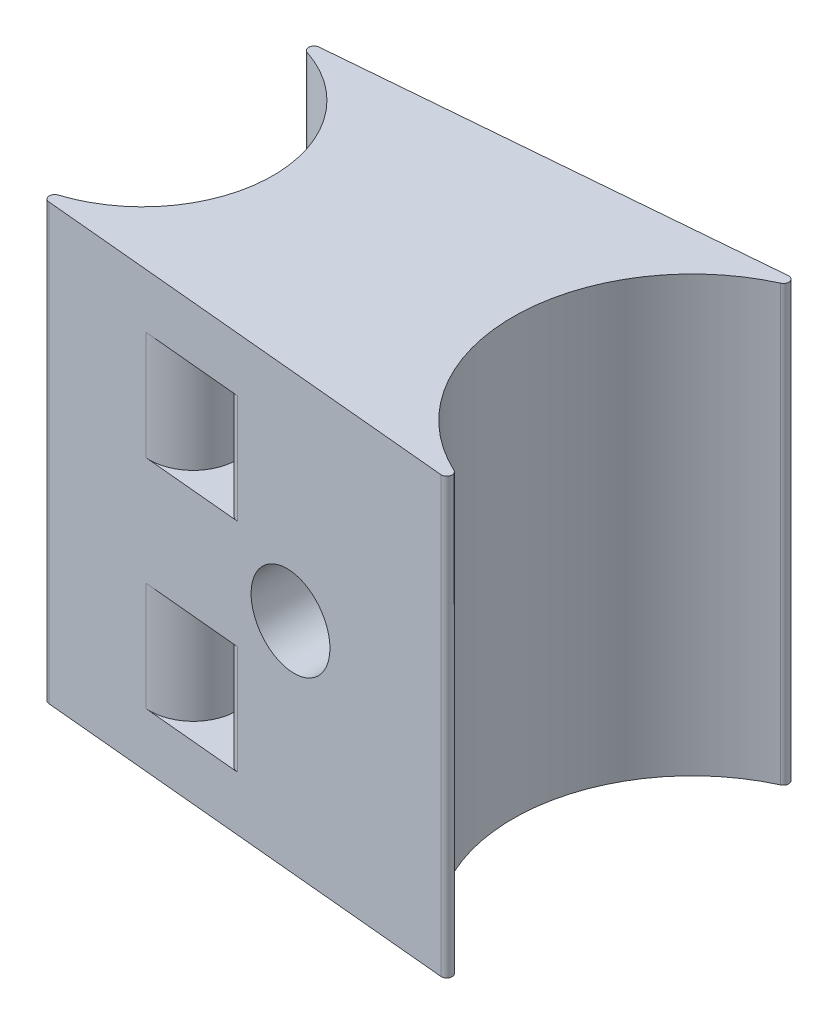
ISO-10303-21;
HEADER;
FILE_DESCRIPTION(('STEP AP214'),'2;1');
FILE_NAME('part.step','',(''),(''),'','','');
FILE_SCHEMA(('AUTOMOTIVE_DESIGN { 1 0 10303 214 1 1 1 1 }'));
ENDSEC;
DATA;
#1=APPLICATION_CONTEXT('core data for automotive mechanical design processes');
#2=APPLICATION_PROTOCOL_DEFINITION('international standard','automotive_design',2000,#1);
#3=PRODUCT_CONTEXT('',#1,'mechanical');
#4=PRODUCT('Part','Part','',(#3));
#5=PRODUCT_RELATED_PRODUCT_CATEGORY('part','',(#4));
#6=PRODUCT_DEFINITION_FORMATION('','',#4);
#7=PRODUCT_DEFINITION_CONTEXT('part definition',#1,'design');
#8=PRODUCT_DEFINITION('design','',#6,#7);
#9=PRODUCT_DEFINITION_SHAPE('','',#8);
#10=(LENGTH_UNIT() NAMED_UNIT(*) SI_UNIT(.MILLI.,.METRE.));
#11=(NAMED_UNIT(*) PLANE_ANGLE_UNIT() SI_UNIT($,.RADIAN.));
#12=(NAMED_UNIT(*) SI_UNIT($,.STERADIAN.) SOLID_ANGLE_UNIT());
#13=UNCERTAINTY_MEASURE_WITH_UNIT(LENGTH_MEASURE(1.E-05),#10,'distance_accuracy_value','');
#14=(GEOMETRIC_REPRESENTATION_CONTEXT(3) GLOBAL_UNCERTAINTY_ASSIGNED_CONTEXT((#13)) GLOBAL_UNIT_ASSIGNED_CONTEXT((#10,
#11,#12)) REPRESENTATION_CONTEXT('',''));
#15=CARTESIAN_POINT('',(0.,0.,0.));
#16=DIRECTION('',(0.,0.,1.));
#17=DIRECTION('',(1.,0.,0.));
#18=AXIS2_PLACEMENT_3D('',#15,#16,#17);
#19=CARTESIAN_POINT('',(21.8612762014715,20.,-7.62602887624097));
#20=DIRECTION('',(0.,-1.,0.));
#21=DIRECTION('',(0.,0.,-1.));
#22=AXIS2_PLACEMENT_3D('',#19,#20,#21);
#23=CYLINDRICAL_SURFACE('',#22,0.25);
#24=CARTESIAN_POINT('',(21.8612762014715,0.,-7.62602887624097));
#25=DIRECTION('',(0.,1.,0.));
#26=DIRECTION('',(0.,0.,-1.));
#27=AXIS2_PLACEMENT_3D('',#24,#25,#26);
#28=CIRCLE('',#27,0.25);
#29=CARTESIAN_POINT('',(21.9653502400434,0.,-7.39872160733973));
#30=VERTEX_POINT('',#29);
#31=CARTESIAN_POINT('',(21.8401348031813,0.,-7.87513335488063));
#32=VERTEX_POINT('',#31);
#33=EDGE_CURVE('E218',#30,#32,#28,.T.);
#34=ORIENTED_EDGE('',*,*,#33,.T.);
#35=DIRECTION('',(0.,-1.,0.));
#36=VECTOR('',#35,1.);
#37=CARTESIAN_POINT('',(21.8401348031813,20.,-7.87513335488063));
#38=LINE('',#37,#36);
#39=CARTESIAN_POINT('',(21.8401348031813,20.,-7.87513335488063));
#40=VERTEX_POINT('',#39);
#41=EDGE_CURVE('E199',#40,#32,#38,.T.);
#42=ORIENTED_EDGE('',*,*,#41,.F.);
#43=CARTESIAN_POINT('',(21.8612762014715,20.,-7.62602887624097));
#44=DIRECTION('',(0.,1.,0.));
#45=DIRECTION('',(0.,0.,-1.));
#46=AXIS2_PLACEMENT_3D('',#43,#44,#45);
#47=CIRCLE('',#46,0.25);
#48=CARTESIAN_POINT('',(21.9653502400434,20.,-7.39872160733973));
#49=VERTEX_POINT('',#48);
#50=EDGE_CURVE('E206',#49,#40,#47,.T.);
#51=ORIENTED_EDGE('',*,*,#50,.F.);
#52=DIRECTION('',(0.,-1.,0.));
#53=VECTOR('',#52,1.);
#54=CARTESIAN_POINT('',(21.9653502400434,20.,-7.39872160733973));
#55=LINE('',#54,#53);
#56=EDGE_CURVE('E365',#49,#30,#55,.T.);
#57=ORIENTED_EDGE('',*,*,#56,.T.);
#58=EDGE_LOOP('',(#34,#42,#51,#57));
#59=FACE_BOUND('',#58,.T.);
#60=ADVANCED_FACE('F33',(#59),#23,.T.);
#61=CARTESIAN_POINT('',(1.93332190227241,20.,-6.18565004039137));
#62=DIRECTION('',(0.0845655931607277,0.,0.996417914558633));
#63=DIRECTION('',(0.996417914558633,0.,-0.0845655931607277));
#64=AXIS2_PLACEMENT_3D('',#61,#62,#63);
#65=PLANE('',#64);
#66=DIRECTION('',(0.,1.,0.));
#67=VECTOR('',#66,1.);
#68=CARTESIAN_POINT('',(11.4577172034196,20.,-6.99398169156962));
#69=LINE('',#68,#67);
#70=CARTESIAN_POINT('',(11.4577172034196,12.5,-6.99398169156962));
#71=VERTEX_POINT('',#70);
#72=CARTESIAN_POINT('',(11.4577172034196,17.5,-6.99398169156962));
#73=VERTEX_POINT('',#72);
#74=EDGE_CURVE('E276',#71,#73,#69,.T.);
#75=ORIENTED_EDGE('',*,*,#74,.T.);
#76=DIRECTION('',(-0.996417914558633,0.,0.0845655931607277));
#77=VECTOR('',#76,1.);
#78=CARTESIAN_POINT('',(1.93332190227241,17.5,-6.18565004039137));
#79=LINE('',#78,#77);
#80=CARTESIAN_POINT('',(6.83086881367855,17.5,-6.60130290405853));
#81=VERTEX_POINT('',#80);
#82=EDGE_CURVE('E351',#73,#81,#79,.T.);
#83=ORIENTED_EDGE('',*,*,#82,.T.);
#84=DIRECTION('',(0.,-1.,0.));
#85=VECTOR('',#84,1.);
#86=CARTESIAN_POINT('',(6.83086881367855,20.,-6.60130290405853));
#87=LINE('',#86,#85);
#88=CARTESIAN_POINT('',(6.83086881367854,12.5,-6.60130290405853));
#89=VERTEX_POINT('',#88);
#90=EDGE_CURVE('E235',#81,#89,#87,.T.);
#91=ORIENTED_EDGE('',*,*,#90,.T.);
#92=DIRECTION('',(0.996417914558633,0.,-0.0845655931607277));
#93=VECTOR('',#92,1.);
#94=CARTESIAN_POINT('',(1.93332190227241,12.5,-6.18565004039137));
#95=LINE('',#94,#93);
#96=EDGE_CURVE('E353',#89,#71,#95,.T.);
#97=ORIENTED_EDGE('',*,*,#96,.T.);
#98=EDGE_LOOP('',(#75,#83,#91,#97));
#99=FACE_BOUND('',#98,.T.);
#100=DIRECTION('',(0.,1.,0.));
#101=VECTOR('',#100,1.);
#102=CARTESIAN_POINT('',(11.4577172034196,20.,-6.99398169156962));
#103=LINE('',#102,#101);
#104=CARTESIAN_POINT('',(11.4577172034196,2.5,-6.99398169156962));
#105=VERTEX_POINT('',#104);
#106=CARTESIAN_POINT('',(11.4577172034196,7.5,-6.99398169156962));
#107=VERTEX_POINT('',#106);
#108=EDGE_CURVE('E273',#105,#107,#103,.T.);
#109=ORIENTED_EDGE('',*,*,#108,.T.);
#110=DIRECTION('',(-0.996417914558633,0.,0.0845655931607277));
#111=VECTOR('',#110,1.);
#112=CARTESIAN_POINT('',(1.93332190227241,7.5,-6.18565004039137));
#113=LINE('',#112,#111);
#114=CARTESIAN_POINT('',(6.83086881367855,7.5,-6.60130290405853));
#115=VERTEX_POINT('',#114);
#116=EDGE_CURVE('E347',#107,#115,#113,.T.);
#117=ORIENTED_EDGE('',*,*,#116,.T.);
#118=DIRECTION('',(0.,-1.,0.));
#119=VECTOR('',#118,1.);
#120=CARTESIAN_POINT('',(6.83086881367854,20.,-6.60130290405853));
#121=LINE('',#120,#119);
#122=CARTESIAN_POINT('',(6.83086881367854,2.5,-6.60130290405853));
#123=VERTEX_POINT('',#122);
#124=EDGE_CURVE('E238',#115,#123,#121,.T.);
#125=ORIENTED_EDGE('',*,*,#124,.T.);
#126=DIRECTION('',(0.996417914558633,0.,-0.0845655931607277));
#127=VECTOR('',#126,1.);
#128=CARTESIAN_POINT('',(1.93332190227241,2.5,-6.18565004039137));
#129=LINE('',#128,#127);
#130=EDGE_CURVE('E349',#123,#105,#129,.T.);
#131=ORIENTED_EDGE('',*,*,#130,.T.);
#132=EDGE_LOOP('',(#109,#117,#125,#131));
#133=FACE_BOUND('',#132,.T.);
#134=CARTESIAN_POINT('',(14.1497935129148,10.,-7.22245714009389));
#135=DIRECTION('',(0.0845655931607277,0.,0.996417914558633));
#136=DIRECTION('',(-0.996417914558632,0.,0.0845655931607277));
#137=AXIS2_PLACEMENT_3D('',#134,#135,#136);
#138=ELLIPSE('',#137,2.00718992581131,2.);
#139=CARTESIAN_POINT('',(12.1497935129148,10.,-7.05271793343142));
#140=VERTEX_POINT('',#139);
#141=EDGE_CURVE('E227',#140,#140,#138,.T.);
#142=ORIENTED_EDGE('',*,*,#141,.T.);
#143=EDGE_LOOP('',(#142));
#144=FACE_BOUND('',#143,.T.);
#145=DIRECTION('',(-0.996417914558632,0.,0.0845655931607277));
#146=VECTOR('',#145,1.);
#147=CARTESIAN_POINT('',(1.93332190227241,0.,-6.18565004039137));
#148=LINE('',#147,#146);
#149=CARTESIAN_POINT('',(1.93332190227241,0.,-6.18565004039137));
#150=VERTEX_POINT('',#149);
#151=EDGE_CURVE('E367',#32,#150,#148,.T.);
#152=ORIENTED_EDGE('',*,*,#151,.T.);
#153=DIRECTION('',(0.,-1.,0.));
#154=VECTOR('',#153,1.);
#155=CARTESIAN_POINT('',(1.93332190227241,20.,-6.18565004039137));
#156=LINE('',#155,#154);
#157=CARTESIAN_POINT('',(1.93332190227241,20.,-6.18565004039137));
#158=VERTEX_POINT('',#157);
#159=EDGE_CURVE('E202',#158,#150,#156,.T.);
#160=ORIENTED_EDGE('',*,*,#159,.F.);
#161=DIRECTION('',(-0.996417914558632,0.,0.0845655931607277));
#162=VECTOR('',#161,1.);
#163=CARTESIAN_POINT('',(1.93332190227241,20.,-6.18565004039137));
#164=LINE('',#163,#162);
#165=EDGE_CURVE('E195',#40,#158,#164,.T.);
#166=ORIENTED_EDGE('',*,*,#165,.F.);
#167=ORIENTED_EDGE('',*,*,#41,.T.);
#168=EDGE_LOOP('',(#152,#160,#166,#167));
#169=FACE_BOUND('',#168,.T.);
#170=ADVANCED_FACE('F197',(#99,#133,#144,#169),#65,.F.);
#171=CARTESIAN_POINT('',(1.95446330056259,20.,-5.93654556175172));
#172=DIRECTION('',(0.,-1.,0.));
#173=DIRECTION('',(0.,0.,-1.));
#174=AXIS2_PLACEMENT_3D('',#171,#172,#173);
#175=CYLINDRICAL_SURFACE('',#174,0.25);
#176=CARTESIAN_POINT('',(1.95446330056259,0.,-5.93654556175172));
#177=DIRECTION('',(0.,1.,0.));
#178=DIRECTION('',(0.,0.,1.));
#179=AXIS2_PLACEMENT_3D('',#176,#177,#178);
#180=CIRCLE('',#179,0.25);
#181=CARTESIAN_POINT('',(1.87628476854009,0.,-5.69908373928165));
#182=VERTEX_POINT('',#181);
#183=EDGE_CURVE('E369',#150,#182,#180,.T.);
#184=ORIENTED_EDGE('',*,*,#183,.T.);
#185=DIRECTION('',(0.,-1.,0.));
#186=VECTOR('',#185,1.);
#187=CARTESIAN_POINT('',(1.87628476854009,20.,-5.69908373928165));
#188=LINE('',#187,#186);
#189=CARTESIAN_POINT('',(1.87628476854009,20.,-5.69908373928165));
#190=VERTEX_POINT('',#189);
#191=EDGE_CURVE('E221',#190,#182,#188,.T.);
#192=ORIENTED_EDGE('',*,*,#191,.F.);
#193=CARTESIAN_POINT('',(1.95446330056259,20.,-5.93654556175172));
#194=DIRECTION('',(0.,1.,0.));
#195=DIRECTION('',(0.,0.,1.));
#196=AXIS2_PLACEMENT_3D('',#193,#194,#195);
#197=CIRCLE('',#196,0.25);
#198=EDGE_CURVE('E205',#158,#190,#197,.T.);
#199=ORIENTED_EDGE('',*,*,#198,.F.);
#200=ORIENTED_EDGE('',*,*,#159,.T.);
#201=EDGE_LOOP('',(#184,#192,#199,#200));
#202=FACE_BOUND('',#201,.T.);
#203=ADVANCED_FACE('F416',(#202),#175,.T.);
#204=CARTESIAN_POINT('',(0.,20.,0.));
#205=DIRECTION('',(0.,-1.,0.));
#206=DIRECTION('',(0.,0.,-1.));
#207=AXIS2_PLACEMENT_3D('',#204,#205,#206);
#208=CYLINDRICAL_SURFACE('',#207,6.);
#209=CARTESIAN_POINT('',(0.,0.,0.));
#210=DIRECTION('',(0.,-1.,0.));
#211=DIRECTION('',(0.,0.,1.));
#212=AXIS2_PLACEMENT_3D('',#209,#210,#211);
#213=CIRCLE('',#212,6.);
#214=CARTESIAN_POINT('',(1.83026426573769,0.,5.71402946418407));
#215=VERTEX_POINT('',#214);
#216=EDGE_CURVE('E371',#182,#215,#213,.T.);
#217=ORIENTED_EDGE('',*,*,#216,.T.);
#218=DIRECTION('',(0.,-1.,0.));
#219=VECTOR('',#218,1.);
#220=CARTESIAN_POINT('',(1.83026426573769,20.,5.71402946418407));
#221=LINE('',#220,#219);
#222=CARTESIAN_POINT('',(1.83026426573769,20.,5.71402946418407));
#223=VERTEX_POINT('',#222);
#224=EDGE_CURVE('E390',#223,#215,#221,.T.);
#225=ORIENTED_EDGE('',*,*,#224,.F.);
#226=CARTESIAN_POINT('',(0.,20.,0.));
#227=DIRECTION('',(0.,-1.,0.));
#228=DIRECTION('',(0.,0.,1.));
#229=AXIS2_PLACEMENT_3D('',#226,#227,#228);
#230=CIRCLE('',#229,6.);
#231=EDGE_CURVE('E356',#190,#223,#230,.T.);
#232=ORIENTED_EDGE('',*,*,#231,.F.);
#233=ORIENTED_EDGE('',*,*,#191,.T.);
#234=EDGE_LOOP('',(#217,#225,#232,#233));
#235=FACE_BOUND('',#234,.T.);
#236=ADVANCED_FACE('F397',(#235),#208,.F.);
#237=CARTESIAN_POINT('',(1.90652527681009,20.,5.95211402519174));
#238=DIRECTION('',(0.,-1.,0.));
#239=DIRECTION('',(0.,0.,-1.));
#240=AXIS2_PLACEMENT_3D('',#237,#238,#239);
#241=CYLINDRICAL_SURFACE('',#240,0.250000000000001);
#242=CARTESIAN_POINT('',(1.90652527681009,0.,5.95211402519174));
#243=DIRECTION('',(0.,1.,0.));
#244=DIRECTION('',(0.,0.,-1.));
#245=AXIS2_PLACEMENT_3D('',#242,#243,#244);
#246=CIRCLE('',#245,0.250000000000001);
#247=CARTESIAN_POINT('',(1.88337569658017,0.,6.20103991162218));
#248=VERTEX_POINT('',#247);
#249=EDGE_CURVE('E373',#215,#248,#246,.T.);
#250=ORIENTED_EDGE('',*,*,#249,.T.);
#251=DIRECTION('',(0.,-1.,0.));
#252=VECTOR('',#251,1.);
#253=CARTESIAN_POINT('',(1.88337569658017,20.,6.20103991162218));
#254=LINE('',#253,#252);
#255=CARTESIAN_POINT('',(1.88337569658017,20.,6.20103991162218));
#256=VERTEX_POINT('',#255);
#257=EDGE_CURVE('E387',#256,#248,#254,.T.);
#258=ORIENTED_EDGE('',*,*,#257,.F.);
#259=CARTESIAN_POINT('',(1.90652527681009,20.,5.95211402519174));
#260=DIRECTION('',(0.,1.,0.));
#261=DIRECTION('',(0.,0.,-1.));
#262=AXIS2_PLACEMENT_3D('',#259,#260,#261);
#263=CIRCLE('',#262,0.250000000000001);
#264=EDGE_CURVE('E358',#223,#256,#263,.T.);
#265=ORIENTED_EDGE('',*,*,#264,.F.);
#266=ORIENTED_EDGE('',*,*,#224,.T.);
#267=EDGE_LOOP('',(#250,#258,#265,#266));
#268=FACE_BOUND('',#267,.T.);
#269=ADVANCED_FACE('F408',(#268),#241,.T.);
#270=CARTESIAN_POINT('',(1.88337569658017,20.,6.20103991162218));
#271=DIRECTION('',(0.0925983209196808,0.,-0.995703545721745));
#272=DIRECTION('',(-0.995703545721745,0.,-0.0925983209196808));
#273=AXIS2_PLACEMENT_3D('',#270,#271,#272);
#274=PLANE('',#273);
#275=DIRECTION('',(0.,-1.,0.));
#276=VECTOR('',#275,1.);
#277=CARTESIAN_POINT('',(11.4537008395402,20.,7.0910598806192));
#278=LINE('',#277,#276);
#279=CARTESIAN_POINT('',(11.4537008395402,17.5,7.0910598806192));
#280=VERTEX_POINT('',#279);
#281=CARTESIAN_POINT('',(11.4537008395402,12.5,7.0910598806192));
#282=VERTEX_POINT('',#281);
#283=EDGE_CURVE('E287',#280,#282,#278,.T.);
#284=ORIENTED_EDGE('',*,*,#283,.T.);
#285=DIRECTION('',(-0.995703545721745,0.,-0.0925983209196808));
#286=VECTOR('',#285,1.);
#287=CARTESIAN_POINT('',(1.88337569658017,12.5,6.20103991162218));
#288=LINE('',#287,#286);
#289=CARTESIAN_POINT('',(6.81480335816064,12.5,6.65965223972051));
#290=VERTEX_POINT('',#289);
#291=EDGE_CURVE('E233',#282,#290,#288,.T.);
#292=ORIENTED_EDGE('',*,*,#291,.T.);
#293=DIRECTION('',(0.,1.,0.));
#294=VECTOR('',#293,1.);
#295=CARTESIAN_POINT('',(6.81480335816064,20.,6.65965223972051));
#296=LINE('',#295,#294);
#297=CARTESIAN_POINT('',(6.81480335816064,17.5,6.65965223972051));
#298=VERTEX_POINT('',#297);
#299=EDGE_CURVE('E249',#290,#298,#296,.T.);
#300=ORIENTED_EDGE('',*,*,#299,.T.);
#301=DIRECTION('',(0.995703545721745,0.,0.0925983209196808));
#302=VECTOR('',#301,1.);
#303=CARTESIAN_POINT('',(1.88337569658017,17.5,6.20103991162218));
#304=LINE('',#303,#302);
#305=EDGE_CURVE('E231',#298,#280,#304,.T.);
#306=ORIENTED_EDGE('',*,*,#305,.T.);
#307=EDGE_LOOP('',(#284,#292,#300,#306));
#308=FACE_BOUND('',#307,.T.);
#309=DIRECTION('',(0.,-1.,0.));
#310=VECTOR('',#309,1.);
#311=CARTESIAN_POINT('',(11.4537008395402,20.,7.0910598806192));
#312=LINE('',#311,#310);
#313=CARTESIAN_POINT('',(11.4537008395402,7.5,7.0910598806192));
#314=VERTEX_POINT('',#313);
#315=CARTESIAN_POINT('',(11.4537008395402,2.5,7.0910598806192));
#316=VERTEX_POINT('',#315);
#317=EDGE_CURVE('E290',#314,#316,#312,.T.);
#318=ORIENTED_EDGE('',*,*,#317,.T.);
#319=DIRECTION('',(-0.995703545721745,0.,-0.0925983209196808));
#320=VECTOR('',#319,1.);
#321=CARTESIAN_POINT('',(1.88337569658017,2.5,6.20103991162218));
#322=LINE('',#321,#320);
#323=CARTESIAN_POINT('',(6.81480335816064,2.5,6.65965223972051));
#324=VERTEX_POINT('',#323);
#325=EDGE_CURVE('E48',#316,#324,#322,.T.);
#326=ORIENTED_EDGE('',*,*,#325,.T.);
#327=DIRECTION('',(0.,1.,0.));
#328=VECTOR('',#327,1.);
#329=CARTESIAN_POINT('',(6.81480335816064,20.,6.65965223972051));
#330=LINE('',#329,#328);
#331=CARTESIAN_POINT('',(6.81480335816064,7.5,6.65965223972051));
#332=VERTEX_POINT('',#331);
#333=EDGE_CURVE('E252',#324,#332,#330,.T.);
#334=ORIENTED_EDGE('',*,*,#333,.T.);
#335=DIRECTION('',(0.995703545721745,0.,0.0925983209196808));
#336=VECTOR('',#335,1.);
#337=CARTESIAN_POINT('',(1.88337569658017,7.5,6.20103991162218));
#338=LINE('',#337,#336);
#339=EDGE_CURVE('E56',#332,#314,#338,.T.);
#340=ORIENTED_EDGE('',*,*,#339,.T.);
#341=EDGE_LOOP('',(#318,#326,#334,#340));
#342=FACE_BOUND('',#341,.T.);
#343=CARTESIAN_POINT('',(14.1497935129148,10.,7.34179078910199));
#344=DIRECTION('',(0.0925983209196808,0.,-0.995703545721745));
#345=DIRECTION('',(0.995703545721745,0.,0.0925983209196808));
#346=AXIS2_PLACEMENT_3D('',#343,#344,#345);
#347=ELLIPSE('',#346,2.00862998690065,2.);
#348=CARTESIAN_POINT('',(16.1497935129148,10.,7.52778655323791));
#349=VERTEX_POINT('',#348);
#350=EDGE_CURVE('E225',#349,#349,#347,.T.);
#351=ORIENTED_EDGE('',*,*,#350,.T.);
#352=EDGE_LOOP('',(#351));
#353=FACE_BOUND('',#352,.T.);
#354=DIRECTION('',(0.995703545721745,0.,0.0925983209196808));
#355=VECTOR('',#354,1.);
#356=CARTESIAN_POINT('',(1.88337569658017,0.,6.20103991162218));
#357=LINE('',#356,#355);
#358=CARTESIAN_POINT('',(21.7759166674381,0.,8.05100409086209));
#359=VERTEX_POINT('',#358);
#360=EDGE_CURVE('E375',#248,#359,#357,.T.);
#361=ORIENTED_EDGE('',*,*,#360,.T.);
#362=DIRECTION('',(0.,-1.,0.));
#363=VECTOR('',#362,1.);
#364=CARTESIAN_POINT('',(21.7759166674381,20.,8.05100409086209));
#365=LINE('',#364,#363);
#366=CARTESIAN_POINT('',(21.7759166674381,20.,8.05100409086209));
#367=VERTEX_POINT('',#366);
#368=EDGE_CURVE('E384',#367,#359,#365,.T.);
#369=ORIENTED_EDGE('',*,*,#368,.F.);
#370=DIRECTION('',(0.995703545721745,0.,0.0925983209196808));
#371=VECTOR('',#370,1.);
#372=CARTESIAN_POINT('',(1.88337569658017,20.,6.20103991162218));
#373=LINE('',#372,#371);
#374=EDGE_CURVE('E360',#256,#367,#373,.T.);
#375=ORIENTED_EDGE('',*,*,#374,.F.);
#376=ORIENTED_EDGE('',*,*,#257,.T.);
#377=EDGE_LOOP('',(#361,#369,#375,#376));
#378=FACE_BOUND('',#377,.T.);
#379=ADVANCED_FACE('F412',(#308,#342,#353,#378),#274,.F.);
#380=CARTESIAN_POINT('',(21.799066247668,20.,7.80207820443166));
#381=DIRECTION('',(0.,-1.,0.));
#382=DIRECTION('',(0.,0.,-1.));
#383=AXIS2_PLACEMENT_3D('',#380,#381,#382);
#384=CYLINDRICAL_SURFACE('',#383,0.249999999999999);
#385=CARTESIAN_POINT('',(21.799066247668,0.,7.80207820443166));
#386=DIRECTION('',(0.,1.,0.));
#387=DIRECTION('',(0.,0.,1.));
#388=AXIS2_PLACEMENT_3D('',#385,#386,#387);
#389=CIRCLE('',#388,0.249999999999999);
#390=CARTESIAN_POINT('',(21.9049699907635,0.,7.575617618019));
#391=VERTEX_POINT('',#390);
#392=EDGE_CURVE('E377',#359,#391,#389,.T.);
#393=ORIENTED_EDGE('',*,*,#392,.T.);
#394=DIRECTION('',(0.,-1.,0.));
#395=VECTOR('',#394,1.);
#396=CARTESIAN_POINT('',(21.9049699907635,20.,7.575617618019));
#397=LINE('',#396,#395);
#398=CARTESIAN_POINT('',(21.9049699907635,20.,7.575617618019));
#399=VERTEX_POINT('',#398);
#400=EDGE_CURVE('E381',#399,#391,#397,.T.);
#401=ORIENTED_EDGE('',*,*,#400,.F.);
#402=CARTESIAN_POINT('',(21.799066247668,20.,7.80207820443166));
#403=DIRECTION('',(0.,1.,0.));
#404=DIRECTION('',(0.,0.,1.));
#405=AXIS2_PLACEMENT_3D('',#402,#403,#404);
#406=CIRCLE('',#405,0.249999999999999);
#407=EDGE_CURVE('E362',#367,#399,#406,.T.);
#408=ORIENTED_EDGE('',*,*,#407,.F.);
#409=ORIENTED_EDGE('',*,*,#368,.T.);
#410=EDGE_LOOP('',(#393,#401,#408,#409));
#411=FACE_BOUND('',#410,.T.);
#412=ADVANCED_FACE('F509',(#411),#384,.T.);
#413=CARTESIAN_POINT('',(25.3997935129148,20.,0.102418266401363));
#414=DIRECTION('',(0.,-1.,0.));
#415=DIRECTION('',(0.,0.,-1.));
#416=AXIS2_PLACEMENT_3D('',#413,#414,#415);
#417=CYLINDRICAL_SURFACE('',#416,8.25);
#418=CARTESIAN_POINT('',(25.3997935129148,0.,0.102418266401363));
#419=DIRECTION('',(0.,-1.,0.));
#420=DIRECTION('',(0.,0.,1.));
#421=AXIS2_PLACEMENT_3D('',#418,#419,#420);
#422=CIRCLE('',#421,8.25);
#423=EDGE_CURVE('E215',#391,#30,#422,.T.);
#424=ORIENTED_EDGE('',*,*,#423,.T.);
#425=ORIENTED_EDGE('',*,*,#56,.F.);
#426=CARTESIAN_POINT('',(25.3997935129148,20.,0.102418266401363));
#427=DIRECTION('',(0.,-1.,0.));
#428=DIRECTION('',(0.,0.,1.));
#429=AXIS2_PLACEMENT_3D('',#426,#427,#428);
#430=CIRCLE('',#429,8.25);
#431=EDGE_CURVE('E211',#399,#49,#430,.T.);
#432=ORIENTED_EDGE('',*,*,#431,.F.);
#433=ORIENTED_EDGE('',*,*,#400,.T.);
#434=EDGE_LOOP('',(#424,#425,#432,#433));
#435=FACE_BOUND('',#434,.T.);
#436=ADVANCED_FACE('F505',(#435),#417,.F.);
#437=CARTESIAN_POINT('',(21.8612762014715,20.,-7.62602887624097));
#438=DIRECTION('',(0.,-1.,0.));
#439=DIRECTION('',(0.,0.,-1.));
#440=AXIS2_PLACEMENT_3D('',#437,#438,#439);
#441=PLANE('',#440);
#442=ORIENTED_EDGE('',*,*,#50,.T.);
#443=ORIENTED_EDGE('',*,*,#165,.T.);
#444=ORIENTED_EDGE('',*,*,#198,.T.);
#445=ORIENTED_EDGE('',*,*,#231,.T.);
#446=ORIENTED_EDGE('',*,*,#264,.T.);
#447=ORIENTED_EDGE('',*,*,#374,.T.);
#448=ORIENTED_EDGE('',*,*,#407,.T.);
#449=ORIENTED_EDGE('',*,*,#431,.T.);
#450=EDGE_LOOP('',(#442,#443,#444,#445,#446,#447,#448,#449));
#451=FACE_BOUND('',#450,.T.);
#452=ADVANCED_FACE('F209',(#451),#441,.F.);
#453=CARTESIAN_POINT('',(21.8612762014715,0.,-7.62602887624097));
#454=DIRECTION('',(0.,-1.,0.));
#455=DIRECTION('',(0.,0.,-1.));
#456=AXIS2_PLACEMENT_3D('',#453,#454,#455);
#457=PLANE('',#456);
#458=ORIENTED_EDGE('',*,*,#33,.F.);
#459=ORIENTED_EDGE('',*,*,#423,.F.);
#460=ORIENTED_EDGE('',*,*,#392,.F.);
#461=ORIENTED_EDGE('',*,*,#360,.F.);
#462=ORIENTED_EDGE('',*,*,#249,.F.);
#463=ORIENTED_EDGE('',*,*,#216,.F.);
#464=ORIENTED_EDGE('',*,*,#183,.F.);
#465=ORIENTED_EDGE('',*,*,#151,.F.);
#466=EDGE_LOOP('',(#458,#459,#460,#461,#462,#463,#464,#465));
#467=FACE_BOUND('',#466,.T.);
#468=ADVANCED_FACE('F403',(#467),#457,.T.);
#469=CARTESIAN_POINT('',(14.1497935129148,10.,-7.87602887624097));
#470=DIRECTION('',(0.,0.,1.));
#471=DIRECTION('',(1.,0.,0.));
#472=AXIS2_PLACEMENT_3D('',#469,#470,#471);
#473=CYLINDRICAL_SURFACE('',#472,2.);
#474=ORIENTED_EDGE('',*,*,#350,.F.);
#475=EDGE_LOOP('',(#474));
#476=FACE_BOUND('',#475,.T.);
#477=ORIENTED_EDGE('',*,*,#141,.F.);
#478=EDGE_LOOP('',(#477));
#479=FACE_BOUND('',#478,.T.);
#480=ADVANCED_FACE('F491',(#476,#479),#473,.F.);
#481=CARTESIAN_POINT('',(11.,7.5,-7.87602887624097));
#482=DIRECTION('',(1.,0.,0.));
#483=DIRECTION('',(0.,0.,-1.));
#484=AXIS2_PLACEMENT_3D('',#481,#482,#483);
#485=PLANE('',#484);
#486=DIRECTION('',(0.,0.,1.));
#487=VECTOR('',#486,1.);
#488=CARTESIAN_POINT('',(11.,7.5,-7.87602887624097));
#489=LINE('',#488,#487);
#490=CARTESIAN_POINT('',(11.,7.5,-6.4957727342903));
#491=VERTEX_POINT('',#490);
#492=CARTESIAN_POINT('',(11.,7.5,6.59320810775833));
#493=VERTEX_POINT('',#492);
#494=EDGE_CURVE('E342',#491,#493,#489,.T.);
#495=ORIENTED_EDGE('',*,*,#494,.F.);
#496=DIRECTION('',(0.,1.,0.));
#497=VECTOR('',#496,1.);
#498=CARTESIAN_POINT('',(11.,7.5,-6.4957727342903));
#499=LINE('',#498,#497);
#500=CARTESIAN_POINT('',(11.,2.5,-6.4957727342903));
#501=VERTEX_POINT('',#500);
#502=EDGE_CURVE('E285',#491,#501,#499,.F.);
#503=ORIENTED_EDGE('',*,*,#502,.T.);
#504=DIRECTION('',(0.,0.,1.));
#505=VECTOR('',#504,1.);
#506=CARTESIAN_POINT('',(11.,2.5,-7.87602887624097));
#507=LINE('',#506,#505);
#508=CARTESIAN_POINT('',(11.,2.5,6.59320810775833));
#509=VERTEX_POINT('',#508);
#510=EDGE_CURVE('E328',#501,#509,#507,.T.);
#511=ORIENTED_EDGE('',*,*,#510,.T.);
#512=DIRECTION('',(0.,-1.,0.));
#513=VECTOR('',#512,1.);
#514=CARTESIAN_POINT('',(11.,7.5,6.59320810775833));
#515=LINE('',#514,#513);
#516=EDGE_CURVE('E283',#509,#493,#515,.F.);
#517=ORIENTED_EDGE('',*,*,#516,.T.);
#518=EDGE_LOOP('',(#495,#503,#511,#517));
#519=FACE_BOUND('',#518,.T.);
#520=ADVANCED_FACE('F470',(#519),#485,.F.);
#521=CARTESIAN_POINT('',(9.,2.5,-7.87602887624097));
#522=DIRECTION('',(0.,-1.,0.));
#523=DIRECTION('',(0.,0.,-1.));
#524=AXIS2_PLACEMENT_3D('',#521,#522,#523);
#525=PLANE('',#524);
#526=ORIENTED_EDGE('',*,*,#130,.F.);
#527=CARTESIAN_POINT('',(7.,2.5,-4.60846707494126));
#528=DIRECTION('',(0.,-1.,0.));
#529=DIRECTION('',(0.,0.,-1.));
#530=AXIS2_PLACEMENT_3D('',#527,#528,#529);
#531=CIRCLE('',#530,2.);
#532=CARTESIAN_POINT('',(9.,2.5,-4.60846707494126));
#533=VERTEX_POINT('',#532);
#534=EDGE_CURVE('E254',#123,#533,#531,.T.);
#535=ORIENTED_EDGE('',*,*,#534,.T.);
#536=DIRECTION('',(0.,0.,1.));
#537=VECTOR('',#536,1.);
#538=CARTESIAN_POINT('',(9.,2.5,-7.87602887624097));
#539=LINE('',#538,#537);
#540=CARTESIAN_POINT('',(9.,2.5,4.66824514827702));
#541=VERTEX_POINT('',#540);
#542=EDGE_CURVE('E333',#533,#541,#539,.T.);
#543=ORIENTED_EDGE('',*,*,#542,.T.);
#544=CARTESIAN_POINT('',(7.,2.5,4.66824514827702));
#545=DIRECTION('',(0.,-1.,0.));
#546=DIRECTION('',(0.,0.,-1.));
#547=AXIS2_PLACEMENT_3D('',#544,#545,#546);
#548=CIRCLE('',#547,2.);
#549=EDGE_CURVE('E266',#541,#324,#548,.T.);
#550=ORIENTED_EDGE('',*,*,#549,.T.);
#551=ORIENTED_EDGE('',*,*,#325,.F.);
#552=CARTESIAN_POINT('',(11.5,2.5,6.59320810775833));
#553=DIRECTION('',(0.,-1.,0.));
#554=DIRECTION('',(0.,0.,-1.));
#555=AXIS2_PLACEMENT_3D('',#552,#553,#554);
#556=CIRCLE('',#555,0.5);
#557=EDGE_CURVE('E302',#316,#509,#556,.T.);
#558=ORIENTED_EDGE('',*,*,#557,.T.);
#559=ORIENTED_EDGE('',*,*,#510,.F.);
#560=CARTESIAN_POINT('',(11.5,2.5,-6.4957727342903));
#561=DIRECTION('',(0.,-1.,0.));
#562=DIRECTION('',(0.,0.,-1.));
#563=AXIS2_PLACEMENT_3D('',#560,#561,#562);
#564=CIRCLE('',#563,0.5);
#565=EDGE_CURVE('E299',#501,#105,#564,.T.);
#566=ORIENTED_EDGE('',*,*,#565,.T.);
#567=EDGE_LOOP('',(#526,#535,#543,#550,#551,#558,#559,#566));
#568=FACE_BOUND('',#567,.T.);
#569=ADVANCED_FACE('F474',(#568),#525,.F.);
#570=CARTESIAN_POINT('',(9.,7.5,-7.87602887624097));
#571=DIRECTION('',(-1.,0.,0.));
#572=DIRECTION('',(0.,0.,1.));
#573=AXIS2_PLACEMENT_3D('',#570,#571,#572);
#574=PLANE('',#573);
#575=ORIENTED_EDGE('',*,*,#542,.F.);
#576=DIRECTION('',(0.,-1.,0.));
#577=VECTOR('',#576,1.);
#578=CARTESIAN_POINT('',(9.,7.5,-4.60846707494126));
#579=LINE('',#578,#577);
#580=CARTESIAN_POINT('',(9.,7.5,-4.60846707494126));
#581=VERTEX_POINT('',#580);
#582=EDGE_CURVE('E243',#533,#581,#579,.F.);
#583=ORIENTED_EDGE('',*,*,#582,.T.);
#584=DIRECTION('',(0.,0.,1.));
#585=VECTOR('',#584,1.);
#586=CARTESIAN_POINT('',(9.,7.5,-7.87602887624097));
#587=LINE('',#586,#585);
#588=CARTESIAN_POINT('',(9.,7.5,4.66824514827702));
#589=VERTEX_POINT('',#588);
#590=EDGE_CURVE('E339',#581,#589,#587,.T.);
#591=ORIENTED_EDGE('',*,*,#590,.T.);
#592=DIRECTION('',(0.,1.,0.));
#593=VECTOR('',#592,1.);
#594=CARTESIAN_POINT('',(9.,7.5,4.66824514827702));
#595=LINE('',#594,#593);
#596=EDGE_CURVE('E241',#589,#541,#595,.F.);
#597=ORIENTED_EDGE('',*,*,#596,.T.);
#598=EDGE_LOOP('',(#575,#583,#591,#597));
#599=FACE_BOUND('',#598,.T.);
#600=ADVANCED_FACE('F484',(#599),#574,.F.);
#601=CARTESIAN_POINT('',(9.,7.5,-7.87602887624097));
#602=DIRECTION('',(0.,1.,0.));
#603=DIRECTION('',(0.,0.,1.));
#604=AXIS2_PLACEMENT_3D('',#601,#602,#603);
#605=PLANE('',#604);
#606=ORIENTED_EDGE('',*,*,#116,.F.);
#607=CARTESIAN_POINT('',(11.5,7.5,-6.4957727342903));
#608=DIRECTION('',(0.,1.,0.));
#609=DIRECTION('',(0.,0.,1.));
#610=AXIS2_PLACEMENT_3D('',#607,#608,#609);
#611=CIRCLE('',#610,0.5);
#612=EDGE_CURVE('E297',#107,#491,#611,.T.);
#613=ORIENTED_EDGE('',*,*,#612,.T.);
#614=ORIENTED_EDGE('',*,*,#494,.T.);
#615=CARTESIAN_POINT('',(11.5,7.5,6.59320810775833));
#616=DIRECTION('',(0.,1.,0.));
#617=DIRECTION('',(0.,0.,1.));
#618=AXIS2_PLACEMENT_3D('',#615,#616,#617);
#619=CIRCLE('',#618,0.5);
#620=EDGE_CURVE('E304',#493,#314,#619,.T.);
#621=ORIENTED_EDGE('',*,*,#620,.T.);
#622=ORIENTED_EDGE('',*,*,#339,.F.);
#623=CARTESIAN_POINT('',(7.,7.5,4.66824514827702));
#624=DIRECTION('',(0.,1.,0.));
#625=DIRECTION('',(0.,0.,1.));
#626=AXIS2_PLACEMENT_3D('',#623,#624,#625);
#627=CIRCLE('',#626,2.);
#628=EDGE_CURVE('E264',#332,#589,#627,.T.);
#629=ORIENTED_EDGE('',*,*,#628,.T.);
#630=ORIENTED_EDGE('',*,*,#590,.F.);
#631=CARTESIAN_POINT('',(7.,7.5,-4.60846707494126));
#632=DIRECTION('',(0.,1.,0.));
#633=DIRECTION('',(0.,0.,1.));
#634=AXIS2_PLACEMENT_3D('',#631,#632,#633);
#635=CIRCLE('',#634,2.);
#636=EDGE_CURVE('E256',#581,#115,#635,.T.);
#637=ORIENTED_EDGE('',*,*,#636,.T.);
#638=EDGE_LOOP('',(#606,#613,#614,#621,#622,#629,#630,#637));
#639=FACE_BOUND('',#638,.T.);
#640=ADVANCED_FACE('F464',(#639),#605,.F.);
#641=CARTESIAN_POINT('',(11.,17.5,-7.87602887624097));
#642=DIRECTION('',(1.,0.,0.));
#643=DIRECTION('',(0.,0.,-1.));
#644=AXIS2_PLACEMENT_3D('',#641,#642,#643);
#645=PLANE('',#644);
#646=DIRECTION('',(0.,0.,1.));
#647=VECTOR('',#646,1.);
#648=CARTESIAN_POINT('',(11.,17.5,-7.87602887624097));
#649=LINE('',#648,#647);
#650=CARTESIAN_POINT('',(11.,17.5,-6.4957727342903));
#651=VERTEX_POINT('',#650);
#652=CARTESIAN_POINT('',(11.,17.5,6.59320810775833));
#653=VERTEX_POINT('',#652);
#654=EDGE_CURVE('E325',#651,#653,#649,.T.);
#655=ORIENTED_EDGE('',*,*,#654,.F.);
#656=DIRECTION('',(0.,1.,0.));
#657=VECTOR('',#656,1.);
#658=CARTESIAN_POINT('',(11.,17.5,-6.4957727342903));
#659=LINE('',#658,#657);
#660=CARTESIAN_POINT('',(11.,12.5,-6.4957727342903));
#661=VERTEX_POINT('',#660);
#662=EDGE_CURVE('E281',#651,#661,#659,.F.);
#663=ORIENTED_EDGE('',*,*,#662,.T.);
#664=DIRECTION('',(0.,0.,1.));
#665=VECTOR('',#664,1.);
#666=CARTESIAN_POINT('',(11.,12.5,-7.87602887624097));
#667=LINE('',#666,#665);
#668=CARTESIAN_POINT('',(11.,12.5,6.59320810775833));
#669=VERTEX_POINT('',#668);
#670=EDGE_CURVE('E228',#661,#669,#667,.T.);
#671=ORIENTED_EDGE('',*,*,#670,.T.);
#672=DIRECTION('',(0.,-1.,0.));
#673=VECTOR('',#672,1.);
#674=CARTESIAN_POINT('',(11.,17.5,6.59320810775833));
#675=LINE('',#674,#673);
#676=EDGE_CURVE('E279',#669,#653,#675,.F.);
#677=ORIENTED_EDGE('',*,*,#676,.T.);
#678=EDGE_LOOP('',(#655,#663,#671,#677));
#679=FACE_BOUND('',#678,.T.);
#680=ADVANCED_FACE('F316',(#679),#645,.F.);
#681=CARTESIAN_POINT('',(9.,12.5,-7.87602887624097));
#682=DIRECTION('',(0.,-1.,0.));
#683=DIRECTION('',(0.,0.,-1.));
#684=AXIS2_PLACEMENT_3D('',#681,#682,#683);
#685=PLANE('',#684);
#686=ORIENTED_EDGE('',*,*,#96,.F.);
#687=CARTESIAN_POINT('',(7.,12.5,-4.60846707494126));
#688=DIRECTION('',(0.,-1.,0.));
#689=DIRECTION('',(0.,0.,-1.));
#690=AXIS2_PLACEMENT_3D('',#687,#688,#689);
#691=CIRCLE('',#690,2.);
#692=CARTESIAN_POINT('',(9.,12.5,-4.60846707494126));
#693=VERTEX_POINT('',#692);
#694=EDGE_CURVE('E259',#89,#693,#691,.T.);
#695=ORIENTED_EDGE('',*,*,#694,.T.);
#696=DIRECTION('',(0.,0.,1.));
#697=VECTOR('',#696,1.);
#698=CARTESIAN_POINT('',(9.,12.5,-7.87602887624097));
#699=LINE('',#698,#697);
#700=CARTESIAN_POINT('',(9.,12.5,4.66824514827702));
#701=VERTEX_POINT('',#700);
#702=EDGE_CURVE('E319',#693,#701,#699,.T.);
#703=ORIENTED_EDGE('',*,*,#702,.T.);
#704=CARTESIAN_POINT('',(7.,12.5,4.66824514827702));
#705=DIRECTION('',(0.,-1.,0.));
#706=DIRECTION('',(0.,0.,-1.));
#707=AXIS2_PLACEMENT_3D('',#704,#705,#706);
#708=CIRCLE('',#707,2.);
#709=EDGE_CURVE('E270',#701,#290,#708,.T.);
#710=ORIENTED_EDGE('',*,*,#709,.T.);
#711=ORIENTED_EDGE('',*,*,#291,.F.);
#712=CARTESIAN_POINT('',(11.5,12.5,6.59320810775833));
#713=DIRECTION('',(0.,-1.,0.));
#714=DIRECTION('',(0.,0.,-1.));
#715=AXIS2_PLACEMENT_3D('',#712,#713,#714);
#716=CIRCLE('',#715,0.5);
#717=EDGE_CURVE('E41',#282,#669,#716,.T.);
#718=ORIENTED_EDGE('',*,*,#717,.T.);
#719=ORIENTED_EDGE('',*,*,#670,.F.);
#720=CARTESIAN_POINT('',(11.5,12.5,-6.4957727342903));
#721=DIRECTION('',(0.,-1.,0.));
#722=DIRECTION('',(0.,0.,-1.));
#723=AXIS2_PLACEMENT_3D('',#720,#721,#722);
#724=CIRCLE('',#723,0.5);
#725=EDGE_CURVE('E294',#661,#71,#724,.T.);
#726=ORIENTED_EDGE('',*,*,#725,.T.);
#727=EDGE_LOOP('',(#686,#695,#703,#710,#711,#718,#719,#726));
#728=FACE_BOUND('',#727,.T.);
#729=ADVANCED_FACE('F309',(#728),#685,.F.);
#730=CARTESIAN_POINT('',(9.,17.5,-7.87602887624097));
#731=DIRECTION('',(-1.,0.,0.));
#732=DIRECTION('',(0.,-1.,0.));
#733=AXIS2_PLACEMENT_3D('',#730,#731,#732);
#734=PLANE('',#733);
#735=ORIENTED_EDGE('',*,*,#702,.F.);
#736=DIRECTION('',(0.,-1.,0.));
#737=VECTOR('',#736,1.);
#738=CARTESIAN_POINT('',(9.,17.5,-4.60846707494126));
#739=LINE('',#738,#737);
#740=CARTESIAN_POINT('',(9.,17.5,-4.60846707494126));
#741=VERTEX_POINT('',#740);
#742=EDGE_CURVE('E247',#693,#741,#739,.F.);
#743=ORIENTED_EDGE('',*,*,#742,.T.);
#744=DIRECTION('',(0.,0.,1.));
#745=VECTOR('',#744,1.);
#746=CARTESIAN_POINT('',(9.,17.5,-7.87602887624097));
#747=LINE('',#746,#745);
#748=CARTESIAN_POINT('',(9.,17.5,4.66824514827702));
#749=VERTEX_POINT('',#748);
#750=EDGE_CURVE('E327',#741,#749,#747,.T.);
#751=ORIENTED_EDGE('',*,*,#750,.T.);
#752=DIRECTION('',(0.,1.,0.));
#753=VECTOR('',#752,1.);
#754=CARTESIAN_POINT('',(9.,17.5,4.66824514827702));
#755=LINE('',#754,#753);
#756=EDGE_CURVE('E245',#749,#701,#755,.F.);
#757=ORIENTED_EDGE('',*,*,#756,.T.);
#758=EDGE_LOOP('',(#735,#743,#751,#757));
#759=FACE_BOUND('',#758,.T.);
#760=ADVANCED_FACE('F566',(#759),#734,.F.);
#761=CARTESIAN_POINT('',(9.,17.5,-7.87602887624097));
#762=DIRECTION('',(0.,1.,0.));
#763=DIRECTION('',(0.,0.,1.));
#764=AXIS2_PLACEMENT_3D('',#761,#762,#763);
#765=PLANE('',#764);
#766=ORIENTED_EDGE('',*,*,#82,.F.);
#767=CARTESIAN_POINT('',(11.5,17.5,-6.4957727342903));
#768=DIRECTION('',(0.,1.,0.));
#769=DIRECTION('',(0.,0.,1.));
#770=AXIS2_PLACEMENT_3D('',#767,#768,#769);
#771=CIRCLE('',#770,0.5);
#772=EDGE_CURVE('E292',#73,#651,#771,.T.);
#773=ORIENTED_EDGE('',*,*,#772,.T.);
#774=ORIENTED_EDGE('',*,*,#654,.T.);
#775=CARTESIAN_POINT('',(11.5,17.5,6.59320810775833));
#776=DIRECTION('',(0.,1.,0.));
#777=DIRECTION('',(0.,0.,1.));
#778=AXIS2_PLACEMENT_3D('',#775,#776,#777);
#779=CIRCLE('',#778,0.5);
#780=EDGE_CURVE('E11',#653,#280,#779,.T.);
#781=ORIENTED_EDGE('',*,*,#780,.T.);
#782=ORIENTED_EDGE('',*,*,#305,.F.);
#783=CARTESIAN_POINT('',(7.,17.5,4.66824514827702));
#784=DIRECTION('',(0.,1.,0.));
#785=DIRECTION('',(0.,0.,1.));
#786=AXIS2_PLACEMENT_3D('',#783,#784,#785);
#787=CIRCLE('',#786,2.);
#788=EDGE_CURVE('E268',#298,#749,#787,.T.);
#789=ORIENTED_EDGE('',*,*,#788,.T.);
#790=ORIENTED_EDGE('',*,*,#750,.F.);
#791=CARTESIAN_POINT('',(7.,17.5,-4.60846707494126));
#792=DIRECTION('',(0.,1.,0.));
#793=DIRECTION('',(0.,0.,1.));
#794=AXIS2_PLACEMENT_3D('',#791,#792,#793);
#795=CIRCLE('',#794,2.);
#796=EDGE_CURVE('E261',#741,#81,#795,.T.);
#797=ORIENTED_EDGE('',*,*,#796,.T.);
#798=EDGE_LOOP('',(#766,#773,#774,#781,#782,#789,#790,#797));
#799=FACE_BOUND('',#798,.T.);
#800=ADVANCED_FACE('F323',(#799),#765,.F.);
#801=CARTESIAN_POINT('',(7.,20.,-4.60846707494126));
#802=DIRECTION('',(0.,-1.,0.));
#803=DIRECTION('',(0.,0.,-1.));
#804=AXIS2_PLACEMENT_3D('',#801,#802,#803);
#805=CYLINDRICAL_SURFACE('',#804,2.);
#806=ORIENTED_EDGE('',*,*,#636,.F.);
#807=ORIENTED_EDGE('',*,*,#582,.F.);
#808=ORIENTED_EDGE('',*,*,#534,.F.);
#809=ORIENTED_EDGE('',*,*,#124,.F.);
#810=EDGE_LOOP('',(#806,#807,#808,#809));
#811=FACE_BOUND('',#810,.T.);
#812=ADVANCED_FACE('F431',(#811),#805,.T.);
#813=CARTESIAN_POINT('',(7.,20.,-4.60846707494126));
#814=DIRECTION('',(0.,-1.,0.));
#815=DIRECTION('',(1.,0.,0.));
#816=AXIS2_PLACEMENT_3D('',#813,#814,#815);
#817=CYLINDRICAL_SURFACE('',#816,2.);
#818=ORIENTED_EDGE('',*,*,#796,.F.);
#819=ORIENTED_EDGE('',*,*,#742,.F.);
#820=ORIENTED_EDGE('',*,*,#694,.F.);
#821=ORIENTED_EDGE('',*,*,#90,.F.);
#822=EDGE_LOOP('',(#818,#819,#820,#821));
#823=FACE_BOUND('',#822,.T.);
#824=ADVANCED_FACE('F434',(#823),#817,.T.);
#825=CARTESIAN_POINT('',(7.,20.,4.66824514827702));
#826=DIRECTION('',(0.,1.,0.));
#827=DIRECTION('',(0.,0.,1.));
#828=AXIS2_PLACEMENT_3D('',#825,#826,#827);
#829=CYLINDRICAL_SURFACE('',#828,2.);
#830=ORIENTED_EDGE('',*,*,#549,.F.);
#831=ORIENTED_EDGE('',*,*,#596,.F.);
#832=ORIENTED_EDGE('',*,*,#628,.F.);
#833=ORIENTED_EDGE('',*,*,#333,.F.);
#834=EDGE_LOOP('',(#830,#831,#832,#833));
#835=FACE_BOUND('',#834,.T.);
#836=ADVANCED_FACE('F438',(#835),#829,.T.);
#837=CARTESIAN_POINT('',(7.,20.,4.66824514827702));
#838=DIRECTION('',(0.,1.,0.));
#839=DIRECTION('',(-1.,0.,0.));
#840=AXIS2_PLACEMENT_3D('',#837,#838,#839);
#841=CYLINDRICAL_SURFACE('',#840,2.);
#842=ORIENTED_EDGE('',*,*,#709,.F.);
#843=ORIENTED_EDGE('',*,*,#756,.F.);
#844=ORIENTED_EDGE('',*,*,#788,.F.);
#845=ORIENTED_EDGE('',*,*,#299,.F.);
#846=EDGE_LOOP('',(#842,#843,#844,#845));
#847=FACE_BOUND('',#846,.T.);
#848=ADVANCED_FACE('F442',(#847),#841,.T.);
#849=CARTESIAN_POINT('',(11.5,20.,-6.4957727342903));
#850=DIRECTION('',(0.,1.,0.));
#851=DIRECTION('',(0.,0.,1.));
#852=AXIS2_PLACEMENT_3D('',#849,#850,#851);
#853=CYLINDRICAL_SURFACE('',#852,0.5);
#854=ORIENTED_EDGE('',*,*,#725,.F.);
#855=ORIENTED_EDGE('',*,*,#662,.F.);
#856=ORIENTED_EDGE('',*,*,#772,.F.);
#857=ORIENTED_EDGE('',*,*,#74,.F.);
#858=EDGE_LOOP('',(#854,#855,#856,#857));
#859=FACE_BOUND('',#858,.T.);
#860=ADVANCED_FACE('F446',(#859),#853,.T.);
#861=CARTESIAN_POINT('',(11.5,20.,-6.4957727342903));
#862=DIRECTION('',(0.,1.,0.));
#863=DIRECTION('',(0.,0.,1.));
#864=AXIS2_PLACEMENT_3D('',#861,#862,#863);
#865=CYLINDRICAL_SURFACE('',#864,0.5);
#866=ORIENTED_EDGE('',*,*,#565,.F.);
#867=ORIENTED_EDGE('',*,*,#502,.F.);
#868=ORIENTED_EDGE('',*,*,#612,.F.);
#869=ORIENTED_EDGE('',*,*,#108,.F.);
#870=EDGE_LOOP('',(#866,#867,#868,#869));
#871=FACE_BOUND('',#870,.T.);
#872=ADVANCED_FACE('F450',(#871),#865,.T.);
#873=CARTESIAN_POINT('',(11.5,20.,6.59320810775833));
#874=DIRECTION('',(0.,-1.,0.));
#875=DIRECTION('',(0.,0.,-1.));
#876=AXIS2_PLACEMENT_3D('',#873,#874,#875);
#877=CYLINDRICAL_SURFACE('',#876,0.5);
#878=ORIENTED_EDGE('',*,*,#620,.F.);
#879=ORIENTED_EDGE('',*,*,#516,.F.);
#880=ORIENTED_EDGE('',*,*,#557,.F.);
#881=ORIENTED_EDGE('',*,*,#317,.F.);
#882=EDGE_LOOP('',(#878,#879,#880,#881));
#883=FACE_BOUND('',#882,.T.);
#884=ADVANCED_FACE('F453',(#883),#877,.T.);
#885=CARTESIAN_POINT('',(11.5,20.,6.59320810775833));
#886=DIRECTION('',(0.,-1.,0.));
#887=DIRECTION('',(0.,0.,-1.));
#888=AXIS2_PLACEMENT_3D('',#885,#886,#887);
#889=CYLINDRICAL_SURFACE('',#888,0.5);
#890=ORIENTED_EDGE('',*,*,#780,.F.);
#891=ORIENTED_EDGE('',*,*,#676,.F.);
#892=ORIENTED_EDGE('',*,*,#717,.F.);
#893=ORIENTED_EDGE('',*,*,#283,.F.);
#894=EDGE_LOOP('',(#890,#891,#892,#893));
#895=FACE_BOUND('',#894,.T.);
#896=ADVANCED_FACE('F35',(#895),#889,.T.);
#897=CLOSED_SHELL('',(#60,#170,#203,#236,#269,#379,#412,#436,#452,#468,#480,#520,#569,#600,#640,
#680,#729,#760,#800,#812,#824,#836,#848,#860,#872,#884,#896));
#898=MANIFOLD_SOLID_BREP('B2',#897);
#899=ADVANCED_BREP_SHAPE_REPRESENTATION('',(#18,#898),#14);
#900=SHAPE_DEFINITION_REPRESENTATION(#9,#899);
ENDSEC;
END-ISO-10303-21;
